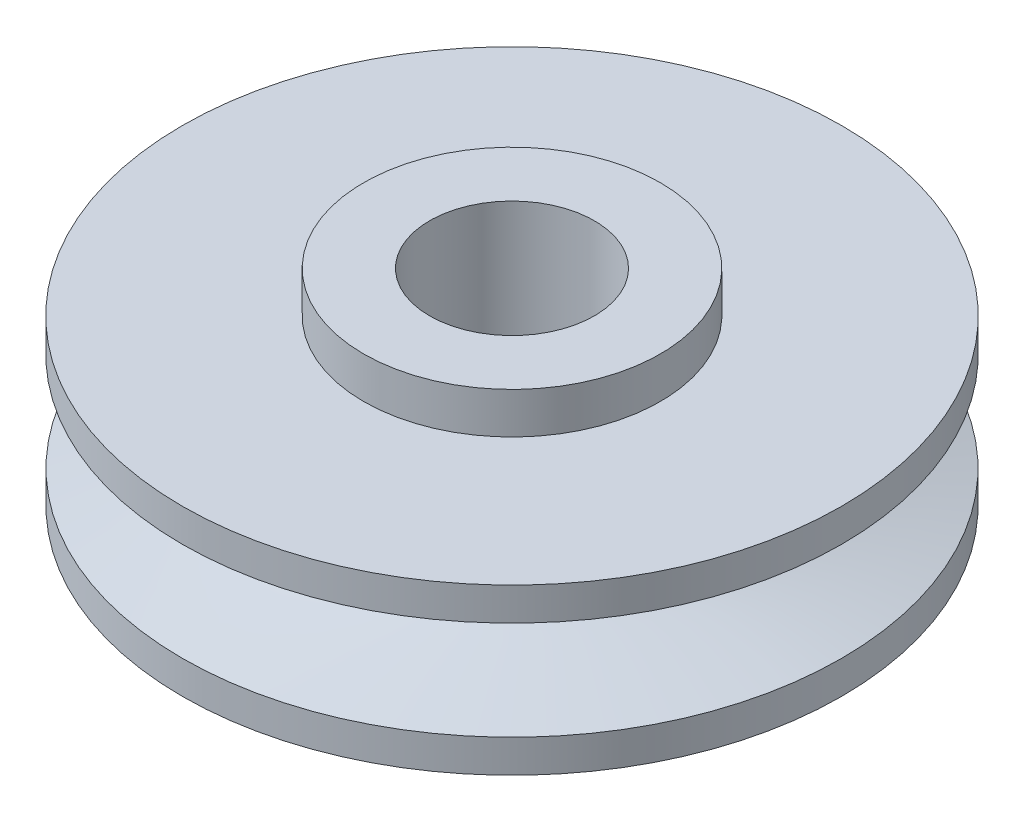
ISO-10303-21;
HEADER;
FILE_DESCRIPTION(('STEP AP214'),'2;1');
FILE_NAME('part.step','',(''),(''),'','','');
FILE_SCHEMA(('AUTOMOTIVE_DESIGN { 1 0 10303 214 1 1 1 1 }'));
ENDSEC;
DATA;
#1=APPLICATION_CONTEXT('core data for automotive mechanical design processes');
#2=APPLICATION_PROTOCOL_DEFINITION('international standard','automotive_design',2000,#1);
#3=PRODUCT_CONTEXT('',#1,'mechanical');
#4=PRODUCT('Part','Part','',(#3));
#5=PRODUCT_RELATED_PRODUCT_CATEGORY('part','',(#4));
#6=PRODUCT_DEFINITION_FORMATION('','',#4);
#7=PRODUCT_DEFINITION_CONTEXT('part definition',#1,'design');
#8=PRODUCT_DEFINITION('design','',#6,#7);
#9=PRODUCT_DEFINITION_SHAPE('','',#8);
#10=(LENGTH_UNIT() NAMED_UNIT(*) SI_UNIT(.MILLI.,.METRE.));
#11=(NAMED_UNIT(*) PLANE_ANGLE_UNIT() SI_UNIT($,.RADIAN.));
#12=(NAMED_UNIT(*) SI_UNIT($,.STERADIAN.) SOLID_ANGLE_UNIT());
#13=UNCERTAINTY_MEASURE_WITH_UNIT(LENGTH_MEASURE(1.E-05),#10,'distance_accuracy_value','');
#14=(GEOMETRIC_REPRESENTATION_CONTEXT(3) GLOBAL_UNCERTAINTY_ASSIGNED_CONTEXT((#13)) GLOBAL_UNIT_ASSIGNED_CONTEXT((#10,
#11,#12)) REPRESENTATION_CONTEXT('',''));
#15=CARTESIAN_POINT('',(0.,0.,0.));
#16=DIRECTION('',(0.,0.,1.));
#17=DIRECTION('',(1.,0.,0.));
#18=AXIS2_PLACEMENT_3D('',#15,#16,#17);
#19=CARTESIAN_POINT('',(0.,2.07863920952884,0.));
#20=DIRECTION('',(0.,1.,0.));
#21=DIRECTION('',(0.,0.,1.));
#22=AXIS2_PLACEMENT_3D('',#19,#20,#21);
#23=CYLINDRICAL_SURFACE('',#22,1.);
#24=CARTESIAN_POINT('',(0.,-1.5,0.));
#25=DIRECTION('',(0.,1.,0.));
#26=DIRECTION('',(0.,0.,1.));
#27=AXIS2_PLACEMENT_3D('',#24,#25,#26);
#28=CIRCLE('',#27,1.);
#29=CARTESIAN_POINT('',(0.,-1.5,1.));
#30=VERTEX_POINT('',#29);
#31=EDGE_CURVE('E79',#30,#30,#28,.T.);
#32=ORIENTED_EDGE('',*,*,#31,.F.);
#33=EDGE_LOOP('',(#32));
#34=FACE_BOUND('',#33,.T.);
#35=CARTESIAN_POINT('',(0.,1.5,0.));
#36=DIRECTION('',(0.,1.,0.));
#37=DIRECTION('',(0.,0.,1.));
#38=AXIS2_PLACEMENT_3D('',#35,#36,#37);
#39=CIRCLE('',#38,1.);
#40=CARTESIAN_POINT('',(0.,1.5,1.));
#41=VERTEX_POINT('',#40);
#42=EDGE_CURVE('E12',#41,#41,#39,.T.);
#43=ORIENTED_EDGE('',*,*,#42,.T.);
#44=EDGE_LOOP('',(#43));
#45=FACE_BOUND('',#44,.T.);
#46=ADVANCED_FACE('F45',(#34,#45),#23,.F.);
#47=CARTESIAN_POINT('',(1.8,1.5,0.));
#48=DIRECTION('',(0.,-1.,0.));
#49=DIRECTION('',(0.,0.,-1.));
#50=AXIS2_PLACEMENT_3D('',#47,#48,#49);
#51=PLANE('',#50);
#52=ORIENTED_EDGE('',*,*,#42,.F.);
#53=EDGE_LOOP('',(#52));
#54=FACE_BOUND('',#53,.T.);
#55=CARTESIAN_POINT('',(0.,1.5,0.));
#56=DIRECTION('',(0.,1.,0.));
#57=DIRECTION('',(0.,0.,1.));
#58=AXIS2_PLACEMENT_3D('',#55,#56,#57);
#59=CIRCLE('',#58,1.8);
#60=CARTESIAN_POINT('',(0.,1.5,1.8));
#61=VERTEX_POINT('',#60);
#62=EDGE_CURVE('E51',#61,#61,#59,.T.);
#63=ORIENTED_EDGE('',*,*,#62,.T.);
#64=EDGE_LOOP('',(#63));
#65=FACE_BOUND('',#64,.T.);
#66=ADVANCED_FACE('F106',(#54,#65),#51,.F.);
#67=CARTESIAN_POINT('',(0.,2.07863920952884,0.));
#68=DIRECTION('',(0.,1.,0.));
#69=DIRECTION('',(0.,0.,1.));
#70=AXIS2_PLACEMENT_3D('',#67,#68,#69);
#71=CYLINDRICAL_SURFACE('',#70,1.8);
#72=ORIENTED_EDGE('',*,*,#62,.F.);
#73=EDGE_LOOP('',(#72));
#74=FACE_BOUND('',#73,.T.);
#75=CARTESIAN_POINT('',(0.,1.,0.));
#76=DIRECTION('',(0.,1.,0.));
#77=DIRECTION('',(0.,0.,1.));
#78=AXIS2_PLACEMENT_3D('',#75,#76,#77);
#79=CIRCLE('',#78,1.8);
#80=CARTESIAN_POINT('',(0.,1.,1.8));
#81=VERTEX_POINT('',#80);
#82=EDGE_CURVE('E55',#81,#81,#79,.T.);
#83=ORIENTED_EDGE('',*,*,#82,.T.);
#84=EDGE_LOOP('',(#83));
#85=FACE_BOUND('',#84,.T.);
#86=ADVANCED_FACE('F103',(#74,#85),#71,.T.);
#87=CARTESIAN_POINT('',(4.,1.,0.));
#88=DIRECTION('',(0.,-1.,0.));
#89=DIRECTION('',(0.,0.,-1.));
#90=AXIS2_PLACEMENT_3D('',#87,#88,#89);
#91=PLANE('',#90);
#92=ORIENTED_EDGE('',*,*,#82,.F.);
#93=EDGE_LOOP('',(#92));
#94=FACE_BOUND('',#93,.T.);
#95=CARTESIAN_POINT('',(0.,1.,0.));
#96=DIRECTION('',(0.,1.,0.));
#97=DIRECTION('',(0.,0.,1.));
#98=AXIS2_PLACEMENT_3D('',#95,#96,#97);
#99=CIRCLE('',#98,4.);
#100=CARTESIAN_POINT('',(0.,1.,4.));
#101=VERTEX_POINT('',#100);
#102=EDGE_CURVE('E59',#101,#101,#99,.T.);
#103=ORIENTED_EDGE('',*,*,#102,.T.);
#104=EDGE_LOOP('',(#103));
#105=FACE_BOUND('',#104,.T.);
#106=ADVANCED_FACE('F99',(#94,#105),#91,.F.);
#107=CARTESIAN_POINT('',(0.,2.07863920952884,0.));
#108=DIRECTION('',(0.,1.,0.));
#109=DIRECTION('',(0.,0.,1.));
#110=AXIS2_PLACEMENT_3D('',#107,#108,#109);
#111=CYLINDRICAL_SURFACE('',#110,4.);
#112=ORIENTED_EDGE('',*,*,#102,.F.);
#113=EDGE_LOOP('',(#112));
#114=FACE_BOUND('',#113,.T.);
#115=CARTESIAN_POINT('',(0.,0.6,0.));
#116=DIRECTION('',(0.,1.,0.));
#117=DIRECTION('',(0.,0.,1.));
#118=AXIS2_PLACEMENT_3D('',#115,#116,#117);
#119=CIRCLE('',#118,4.);
#120=CARTESIAN_POINT('',(0.,0.6,4.));
#121=VERTEX_POINT('',#120);
#122=EDGE_CURVE('E64',#121,#121,#119,.T.);
#123=ORIENTED_EDGE('',*,*,#122,.T.);
#124=EDGE_LOOP('',(#123));
#125=FACE_BOUND('',#124,.T.);
#126=ADVANCED_FACE('F94',(#114,#125),#111,.T.);
#127=CARTESIAN_POINT('',(3.99785866140776,-0.6,0.));
#128=CARTESIAN_POINT('',(2.16864365182922,0.,0.));
#129=CARTESIAN_POINT('',(4.,0.6,0.));
#130=(BOUNDED_CURVE() B_SPLINE_CURVE(2,(#127,#128,#129),.UNSPECIFIED.,.F.,
.F.) B_SPLINE_CURVE_WITH_KNOTS((3,3),(0.,1.),
.UNSPECIFIED.) CURVE() GEOMETRIC_REPRESENTATION_ITEM() RATIONAL_B_SPLINE_CURVE((1.,
2.6781439778484,1.)) REPRESENTATION_ITEM(''));
#131=CARTESIAN_POINT('',(0.,2.07863920952884,0.));
#132=DIRECTION('',(0.,1.,0.));
#133=AXIS1_PLACEMENT('',#131,#132);
#134=SURFACE_OF_REVOLUTION('',#130,#133);
#135=ORIENTED_EDGE('',*,*,#122,.F.);
#136=EDGE_LOOP('',(#135));
#137=FACE_BOUND('',#136,.T.);
#138=CARTESIAN_POINT('',(0.,-0.6,0.));
#139=DIRECTION('',(0.,1.,0.));
#140=DIRECTION('',(0.,0.,1.));
#141=AXIS2_PLACEMENT_3D('',#138,#139,#140);
#142=CIRCLE('',#141,3.99785866140776);
#143=CARTESIAN_POINT('',(0.,-0.6,3.99785866140776));
#144=VERTEX_POINT('',#143);
#145=EDGE_CURVE('E67',#144,#144,#142,.T.);
#146=ORIENTED_EDGE('',*,*,#145,.T.);
#147=EDGE_LOOP('',(#146));
#148=FACE_BOUND('',#147,.T.);
#149=ADVANCED_FACE('F89',(#137,#148),#134,.T.);
#150=CARTESIAN_POINT('',(0.,2.07863920952884,0.));
#151=DIRECTION('',(0.,1.,0.));
#152=DIRECTION('',(0.,0.,1.));
#153=AXIS2_PLACEMENT_3D('',#150,#151,#152);
#154=CYLINDRICAL_SURFACE('',#153,3.99785866140776);
#155=ORIENTED_EDGE('',*,*,#145,.F.);
#156=EDGE_LOOP('',(#155));
#157=FACE_BOUND('',#156,.T.);
#158=CARTESIAN_POINT('',(0.,-1.,0.));
#159=DIRECTION('',(0.,1.,0.));
#160=DIRECTION('',(0.,0.,1.));
#161=AXIS2_PLACEMENT_3D('',#158,#159,#160);
#162=CIRCLE('',#161,3.99785866140776);
#163=CARTESIAN_POINT('',(0.,-1.,3.99785866140776));
#164=VERTEX_POINT('',#163);
#165=EDGE_CURVE('E70',#164,#164,#162,.T.);
#166=ORIENTED_EDGE('',*,*,#165,.T.);
#167=EDGE_LOOP('',(#166));
#168=FACE_BOUND('',#167,.T.);
#169=ADVANCED_FACE('F93',(#157,#168),#154,.T.);
#170=CARTESIAN_POINT('',(1.8,-1.,0.));
#171=DIRECTION('',(0.,1.,0.));
#172=DIRECTION('',(0.,0.,1.));
#173=AXIS2_PLACEMENT_3D('',#170,#171,#172);
#174=PLANE('',#173);
#175=ORIENTED_EDGE('',*,*,#165,.F.);
#176=EDGE_LOOP('',(#175));
#177=FACE_BOUND('',#176,.T.);
#178=CARTESIAN_POINT('',(0.,-1.,0.));
#179=DIRECTION('',(0.,1.,0.));
#180=DIRECTION('',(0.,0.,1.));
#181=AXIS2_PLACEMENT_3D('',#178,#179,#180);
#182=CIRCLE('',#181,1.8);
#183=CARTESIAN_POINT('',(0.,-1.,1.8));
#184=VERTEX_POINT('',#183);
#185=EDGE_CURVE('E73',#184,#184,#182,.T.);
#186=ORIENTED_EDGE('',*,*,#185,.T.);
#187=EDGE_LOOP('',(#186));
#188=FACE_BOUND('',#187,.T.);
#189=ADVANCED_FACE('F126',(#177,#188),#174,.F.);
#190=CARTESIAN_POINT('',(0.,2.07863920952884,0.));
#191=DIRECTION('',(0.,1.,0.));
#192=DIRECTION('',(0.,0.,1.));
#193=AXIS2_PLACEMENT_3D('',#190,#191,#192);
#194=CYLINDRICAL_SURFACE('',#193,1.8);
#195=ORIENTED_EDGE('',*,*,#185,.F.);
#196=EDGE_LOOP('',(#195));
#197=FACE_BOUND('',#196,.T.);
#198=CARTESIAN_POINT('',(0.,-1.5,0.));
#199=DIRECTION('',(0.,1.,0.));
#200=DIRECTION('',(0.,0.,1.));
#201=AXIS2_PLACEMENT_3D('',#198,#199,#200);
#202=CIRCLE('',#201,1.8);
#203=CARTESIAN_POINT('',(0.,-1.5,1.8));
#204=VERTEX_POINT('',#203);
#205=EDGE_CURVE('E76',#204,#204,#202,.T.);
#206=ORIENTED_EDGE('',*,*,#205,.T.);
#207=EDGE_LOOP('',(#206));
#208=FACE_BOUND('',#207,.T.);
#209=ADVANCED_FACE('F120',(#197,#208),#194,.T.);
#210=CARTESIAN_POINT('',(1.,-1.5,0.));
#211=DIRECTION('',(0.,1.,0.));
#212=DIRECTION('',(0.,0.,1.));
#213=AXIS2_PLACEMENT_3D('',#210,#211,#212);
#214=PLANE('',#213);
#215=ORIENTED_EDGE('',*,*,#205,.F.);
#216=EDGE_LOOP('',(#215));
#217=FACE_BOUND('',#216,.T.);
#218=ORIENTED_EDGE('',*,*,#31,.T.);
#219=EDGE_LOOP('',(#218));
#220=FACE_BOUND('',#219,.T.);
#221=ADVANCED_FACE('F118',(#217,#220),#214,.F.);
#222=CLOSED_SHELL('',(#46,#66,#86,#106,#126,#149,#169,#189,#209,#221));
#223=MANIFOLD_SOLID_BREP('B2',#222);
#224=ADVANCED_BREP_SHAPE_REPRESENTATION('',(#18,#223),#14);
#225=SHAPE_DEFINITION_REPRESENTATION(#9,#224);
ENDSEC;
END-ISO-10303-21;
